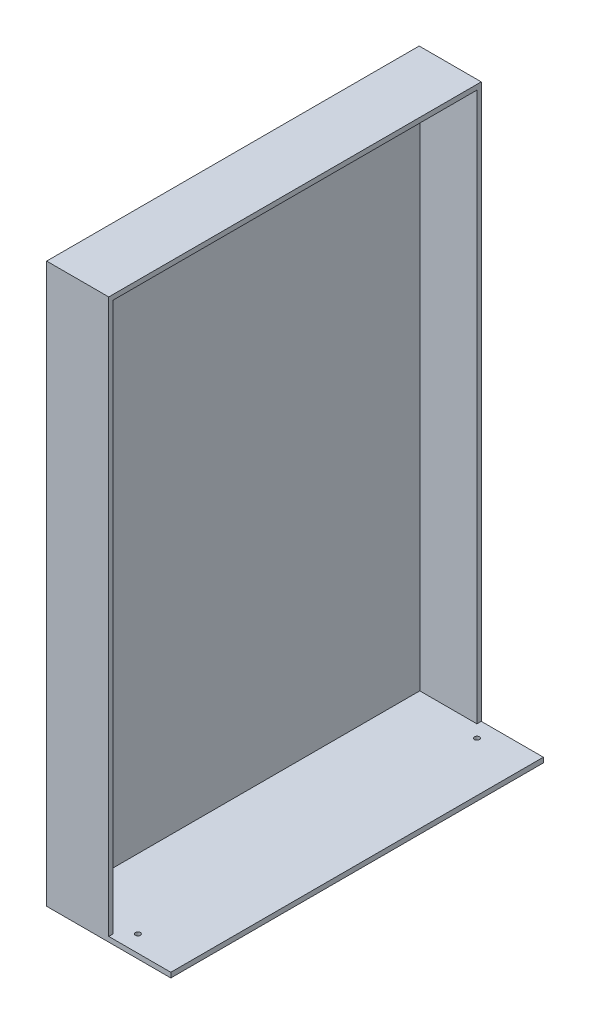
ISO-10303-21;
HEADER;
FILE_DESCRIPTION(('STEP AP214'),'2;1');
FILE_NAME('part.step','',(''),(''),'','','');
FILE_SCHEMA(('AUTOMOTIVE_DESIGN { 1 0 10303 214 1 1 1 1 }'));
ENDSEC;
DATA;
#1=APPLICATION_CONTEXT('core data for automotive mechanical design processes');
#2=APPLICATION_PROTOCOL_DEFINITION('international standard','automotive_design',2000,#1);
#3=PRODUCT_CONTEXT('',#1,'mechanical');
#4=PRODUCT('Part','Part','',(#3));
#5=PRODUCT_RELATED_PRODUCT_CATEGORY('part','',(#4));
#6=PRODUCT_DEFINITION_FORMATION('','',#4);
#7=PRODUCT_DEFINITION_CONTEXT('part definition',#1,'design');
#8=PRODUCT_DEFINITION('design','',#6,#7);
#9=PRODUCT_DEFINITION_SHAPE('','',#8);
#10=(LENGTH_UNIT() NAMED_UNIT(*) SI_UNIT(.MILLI.,.METRE.));
#11=(NAMED_UNIT(*) PLANE_ANGLE_UNIT() SI_UNIT($,.RADIAN.));
#12=(NAMED_UNIT(*) SI_UNIT($,.STERADIAN.) SOLID_ANGLE_UNIT());
#13=UNCERTAINTY_MEASURE_WITH_UNIT(LENGTH_MEASURE(1.E-05),#10,'distance_accuracy_value','');
#14=(GEOMETRIC_REPRESENTATION_CONTEXT(3) GLOBAL_UNCERTAINTY_ASSIGNED_CONTEXT((#13)) GLOBAL_UNIT_ASSIGNED_CONTEXT((#10,
#11,#12)) REPRESENTATION_CONTEXT('',''));
#15=CARTESIAN_POINT('',(0.,0.,0.));
#16=DIRECTION('',(0.,0.,1.));
#17=DIRECTION('',(1.,0.,0.));
#18=AXIS2_PLACEMENT_3D('',#15,#16,#17);
#19=CARTESIAN_POINT('',(0.,4.,0.));
#20=DIRECTION('',(0.,-1.,0.));
#21=DIRECTION('',(0.,0.,-1.));
#22=AXIS2_PLACEMENT_3D('',#19,#20,#21);
#23=PLANE('',#22);
#24=CARTESIAN_POINT('',(60.,4.,-13.5));
#25=DIRECTION('',(0.,-1.,0.));
#26=DIRECTION('',(0.,0.,-1.));
#27=AXIS2_PLACEMENT_3D('',#24,#25,#26);
#28=CIRCLE('',#27,1.99999999999995);
#29=CARTESIAN_POINT('',(60.,4.,-15.4999999999999));
#30=VERTEX_POINT('',#29);
#31=EDGE_CURVE('E356',#30,#30,#28,.T.);
#32=ORIENTED_EDGE('',*,*,#31,.T.);
#33=EDGE_LOOP('',(#32));
#34=FACE_BOUND('',#33,.T.);
#35=CARTESIAN_POINT('',(60.,4.,-286.5));
#36=DIRECTION('',(0.,-1.,0.));
#37=DIRECTION('',(0.,0.,-1.));
#38=AXIS2_PLACEMENT_3D('',#35,#36,#37);
#39=CIRCLE('',#38,1.99999999999995);
#40=CARTESIAN_POINT('',(60.,4.,-288.5));
#41=VERTEX_POINT('',#40);
#42=EDGE_CURVE('E137',#41,#41,#39,.T.);
#43=ORIENTED_EDGE('',*,*,#42,.T.);
#44=EDGE_LOOP('',(#43));
#45=FACE_BOUND('',#44,.T.);
#46=DIRECTION('',(0.,0.,-1.));
#47=VECTOR('',#46,1.);
#48=CARTESIAN_POINT('',(50.,4.,-300.));
#49=LINE('',#48,#47);
#50=CARTESIAN_POINT('',(50.,4.,-296.5));
#51=VERTEX_POINT('',#50);
#52=CARTESIAN_POINT('',(50.,4.,-300.));
#53=VERTEX_POINT('',#52);
#54=EDGE_CURVE('E52',#51,#53,#49,.T.);
#55=ORIENTED_EDGE('',*,*,#54,.F.);
#56=DIRECTION('',(1.,0.,0.));
#57=VECTOR('',#56,1.);
#58=CARTESIAN_POINT('',(4.,4.,-296.5));
#59=LINE('',#58,#57);
#60=CARTESIAN_POINT('',(4.,4.,-296.5));
#61=VERTEX_POINT('',#60);
#62=EDGE_CURVE('E56',#61,#51,#59,.T.);
#63=ORIENTED_EDGE('',*,*,#62,.F.);
#64=DIRECTION('',(0.,0.,-1.));
#65=VECTOR('',#64,1.);
#66=CARTESIAN_POINT('',(4.,4.,-3.5));
#67=LINE('',#66,#65);
#68=CARTESIAN_POINT('',(4.,4.,-3.5));
#69=VERTEX_POINT('',#68);
#70=EDGE_CURVE('E176',#69,#61,#67,.T.);
#71=ORIENTED_EDGE('',*,*,#70,.F.);
#72=DIRECTION('',(-1.,0.,0.));
#73=VECTOR('',#72,1.);
#74=CARTESIAN_POINT('',(4.,4.,-3.5));
#75=LINE('',#74,#73);
#76=CARTESIAN_POINT('',(50.,4.,-3.5));
#77=VERTEX_POINT('',#76);
#78=EDGE_CURVE('E154',#77,#69,#75,.T.);
#79=ORIENTED_EDGE('',*,*,#78,.F.);
#80=DIRECTION('',(0.,0.,-1.));
#81=VECTOR('',#80,1.);
#82=CARTESIAN_POINT('',(50.,4.,0.));
#83=LINE('',#82,#81);
#84=CARTESIAN_POINT('',(50.,4.,0.));
#85=VERTEX_POINT('',#84);
#86=EDGE_CURVE('E144',#85,#77,#83,.T.);
#87=ORIENTED_EDGE('',*,*,#86,.F.);
#88=DIRECTION('',(1.,0.,0.));
#89=VECTOR('',#88,1.);
#90=CARTESIAN_POINT('',(0.,4.,0.));
#91=LINE('',#90,#89);
#92=CARTESIAN_POINT('',(100.,4.,0.));
#93=VERTEX_POINT('',#92);
#94=EDGE_CURVE('E197',#85,#93,#91,.T.);
#95=ORIENTED_EDGE('',*,*,#94,.T.);
#96=DIRECTION('',(0.,0.,-1.));
#97=VECTOR('',#96,1.);
#98=CARTESIAN_POINT('',(100.,4.,0.));
#99=LINE('',#98,#97);
#100=CARTESIAN_POINT('',(100.,4.,-300.));
#101=VERTEX_POINT('',#100);
#102=EDGE_CURVE('E194',#93,#101,#99,.T.);
#103=ORIENTED_EDGE('',*,*,#102,.T.);
#104=DIRECTION('',(-1.,0.,0.));
#105=VECTOR('',#104,1.);
#106=CARTESIAN_POINT('',(0.,4.,-300.));
#107=LINE('',#106,#105);
#108=EDGE_CURVE('E201',#101,#53,#107,.T.);
#109=ORIENTED_EDGE('',*,*,#108,.T.);
#110=EDGE_LOOP('',(#55,#63,#71,#79,#87,#95,#103,#109));
#111=FACE_BOUND('',#110,.T.);
#112=ADVANCED_FACE('F35',(#34,#45,#111),#23,.F.);
#113=CARTESIAN_POINT('',(0.,4.,0.));
#114=DIRECTION('',(1.,0.,0.));
#115=DIRECTION('',(0.,0.,-1.));
#116=AXIS2_PLACEMENT_3D('',#113,#114,#115);
#117=PLANE('',#116);
#118=DIRECTION('',(0.,0.,1.));
#119=VECTOR('',#118,1.);
#120=CARTESIAN_POINT('',(0.,0.,0.));
#121=LINE('',#120,#119);
#122=CARTESIAN_POINT('',(0.,0.,-300.));
#123=VERTEX_POINT('',#122);
#124=CARTESIAN_POINT('',(0.,0.,0.));
#125=VERTEX_POINT('',#124);
#126=EDGE_CURVE('E117',#123,#125,#121,.T.);
#127=ORIENTED_EDGE('',*,*,#126,.T.);
#128=DIRECTION('',(0.,-1.,0.));
#129=VECTOR('',#128,1.);
#130=CARTESIAN_POINT('',(0.,4.,0.));
#131=LINE('',#130,#129);
#132=CARTESIAN_POINT('',(0.,450.,0.));
#133=VERTEX_POINT('',#132);
#134=EDGE_CURVE('E11',#133,#125,#131,.T.);
#135=ORIENTED_EDGE('',*,*,#134,.F.);
#136=DIRECTION('',(0.,0.,1.));
#137=VECTOR('',#136,1.);
#138=CARTESIAN_POINT('',(0.,450.,0.));
#139=LINE('',#138,#137);
#140=CARTESIAN_POINT('',(0.,450.,-300.));
#141=VERTEX_POINT('',#140);
#142=EDGE_CURVE('E115',#141,#133,#139,.T.);
#143=ORIENTED_EDGE('',*,*,#142,.F.);
#144=DIRECTION('',(0.,-1.,0.));
#145=VECTOR('',#144,1.);
#146=CARTESIAN_POINT('',(0.,4.,-300.));
#147=LINE('',#146,#145);
#148=EDGE_CURVE('E203',#141,#123,#147,.T.);
#149=ORIENTED_EDGE('',*,*,#148,.T.);
#150=EDGE_LOOP('',(#127,#135,#143,#149));
#151=FACE_BOUND('',#150,.T.);
#152=ADVANCED_FACE('F37',(#151),#117,.F.);
#153=CARTESIAN_POINT('',(0.,4.,0.));
#154=DIRECTION('',(0.,0.,-1.));
#155=DIRECTION('',(-1.,0.,0.));
#156=AXIS2_PLACEMENT_3D('',#153,#154,#155);
#157=PLANE('',#156);
#158=DIRECTION('',(1.,0.,0.));
#159=VECTOR('',#158,1.);
#160=CARTESIAN_POINT('',(0.,0.,0.));
#161=LINE('',#160,#159);
#162=CARTESIAN_POINT('',(100.,0.,0.));
#163=VERTEX_POINT('',#162);
#164=EDGE_CURVE('E208',#125,#163,#161,.T.);
#165=ORIENTED_EDGE('',*,*,#164,.T.);
#166=DIRECTION('',(0.,-1.,0.));
#167=VECTOR('',#166,1.);
#168=CARTESIAN_POINT('',(100.,4.,0.));
#169=LINE('',#168,#167);
#170=EDGE_CURVE('E44',#93,#163,#169,.T.);
#171=ORIENTED_EDGE('',*,*,#170,.F.);
#172=ORIENTED_EDGE('',*,*,#94,.F.);
#173=DIRECTION('',(0.,-1.,0.));
#174=VECTOR('',#173,1.);
#175=CARTESIAN_POINT('',(50.,446.,0.));
#176=LINE('',#175,#174);
#177=CARTESIAN_POINT('',(50.,450.,0.));
#178=VERTEX_POINT('',#177);
#179=EDGE_CURVE('E124',#178,#85,#176,.T.);
#180=ORIENTED_EDGE('',*,*,#179,.F.);
#181=DIRECTION('',(1.,0.,0.));
#182=VECTOR('',#181,1.);
#183=CARTESIAN_POINT('',(0.,450.,0.));
#184=LINE('',#183,#182);
#185=EDGE_CURVE('E120',#133,#178,#184,.T.);
#186=ORIENTED_EDGE('',*,*,#185,.F.);
#187=ORIENTED_EDGE('',*,*,#134,.T.);
#188=EDGE_LOOP('',(#165,#171,#172,#180,#186,#187));
#189=FACE_BOUND('',#188,.T.);
#190=ADVANCED_FACE('F121',(#189),#157,.F.);
#191=CARTESIAN_POINT('',(100.,4.,0.));
#192=DIRECTION('',(-1.,0.,0.));
#193=DIRECTION('',(0.,0.,1.));
#194=AXIS2_PLACEMENT_3D('',#191,#192,#193);
#195=PLANE('',#194);
#196=DIRECTION('',(0.,0.,-1.));
#197=VECTOR('',#196,1.);
#198=CARTESIAN_POINT('',(100.,0.,0.));
#199=LINE('',#198,#197);
#200=CARTESIAN_POINT('',(100.,0.,-300.));
#201=VERTEX_POINT('',#200);
#202=EDGE_CURVE('E210',#163,#201,#199,.T.);
#203=ORIENTED_EDGE('',*,*,#202,.T.);
#204=DIRECTION('',(0.,-1.,0.));
#205=VECTOR('',#204,1.);
#206=CARTESIAN_POINT('',(100.,4.,-300.));
#207=LINE('',#206,#205);
#208=EDGE_CURVE('E214',#101,#201,#207,.T.);
#209=ORIENTED_EDGE('',*,*,#208,.F.);
#210=ORIENTED_EDGE('',*,*,#102,.F.);
#211=ORIENTED_EDGE('',*,*,#170,.T.);
#212=EDGE_LOOP('',(#203,#209,#210,#211));
#213=FACE_BOUND('',#212,.T.);
#214=ADVANCED_FACE('F221',(#213),#195,.F.);
#215=CARTESIAN_POINT('',(0.,4.,-300.));
#216=DIRECTION('',(0.,0.,1.));
#217=DIRECTION('',(1.,0.,0.));
#218=AXIS2_PLACEMENT_3D('',#215,#216,#217);
#219=PLANE('',#218);
#220=DIRECTION('',(-1.,0.,0.));
#221=VECTOR('',#220,1.);
#222=CARTESIAN_POINT('',(0.,0.,-300.));
#223=LINE('',#222,#221);
#224=EDGE_CURVE('E199',#201,#123,#223,.T.);
#225=ORIENTED_EDGE('',*,*,#224,.T.);
#226=ORIENTED_EDGE('',*,*,#148,.F.);
#227=DIRECTION('',(-1.,0.,0.));
#228=VECTOR('',#227,1.);
#229=CARTESIAN_POINT('',(0.,450.,-300.));
#230=LINE('',#229,#228);
#231=CARTESIAN_POINT('',(50.,450.,-300.));
#232=VERTEX_POINT('',#231);
#233=EDGE_CURVE('E133',#232,#141,#230,.T.);
#234=ORIENTED_EDGE('',*,*,#233,.F.);
#235=DIRECTION('',(0.,-1.,0.));
#236=VECTOR('',#235,1.);
#237=CARTESIAN_POINT('',(50.,446.,-300.));
#238=LINE('',#237,#236);
#239=EDGE_CURVE('E160',#232,#53,#238,.T.);
#240=ORIENTED_EDGE('',*,*,#239,.T.);
#241=ORIENTED_EDGE('',*,*,#108,.F.);
#242=ORIENTED_EDGE('',*,*,#208,.T.);
#243=EDGE_LOOP('',(#225,#226,#234,#240,#241,#242));
#244=FACE_BOUND('',#243,.T.);
#245=ADVANCED_FACE('F227',(#244),#219,.F.);
#246=CARTESIAN_POINT('',(0.,0.,0.));
#247=DIRECTION('',(0.,-1.,0.));
#248=DIRECTION('',(0.,0.,-1.));
#249=AXIS2_PLACEMENT_3D('',#246,#247,#248);
#250=PLANE('',#249);
#251=CARTESIAN_POINT('',(60.,0.,-13.5));
#252=DIRECTION('',(0.,-1.,0.));
#253=DIRECTION('',(0.,0.,-1.));
#254=AXIS2_PLACEMENT_3D('',#251,#252,#253);
#255=CIRCLE('',#254,2.);
#256=CARTESIAN_POINT('',(60.,0.,-15.5));
#257=VERTEX_POINT('',#256);
#258=EDGE_CURVE('E354',#257,#257,#255,.T.);
#259=ORIENTED_EDGE('',*,*,#258,.F.);
#260=EDGE_LOOP('',(#259));
#261=FACE_BOUND('',#260,.T.);
#262=CARTESIAN_POINT('',(60.,0.,-286.5));
#263=DIRECTION('',(0.,-1.,0.));
#264=DIRECTION('',(0.,0.,-1.));
#265=AXIS2_PLACEMENT_3D('',#262,#263,#264);
#266=CIRCLE('',#265,2.);
#267=CARTESIAN_POINT('',(60.,0.,-288.5));
#268=VERTEX_POINT('',#267);
#269=EDGE_CURVE('E357',#268,#268,#266,.T.);
#270=ORIENTED_EDGE('',*,*,#269,.F.);
#271=EDGE_LOOP('',(#270));
#272=FACE_BOUND('',#271,.T.);
#273=ORIENTED_EDGE('',*,*,#126,.F.);
#274=ORIENTED_EDGE('',*,*,#224,.F.);
#275=ORIENTED_EDGE('',*,*,#202,.F.);
#276=ORIENTED_EDGE('',*,*,#164,.F.);
#277=EDGE_LOOP('',(#273,#274,#275,#276));
#278=FACE_BOUND('',#277,.T.);
#279=ADVANCED_FACE('F225',(#261,#272,#278),#250,.T.);
#280=CARTESIAN_POINT('',(50.,446.,0.));
#281=DIRECTION('',(-1.,0.,0.));
#282=DIRECTION('',(0.,0.,1.));
#283=AXIS2_PLACEMENT_3D('',#280,#281,#282);
#284=PLANE('',#283);
#285=ORIENTED_EDGE('',*,*,#86,.T.);
#286=DIRECTION('',(0.,-1.,0.));
#287=VECTOR('',#286,1.);
#288=CARTESIAN_POINT('',(50.,446.,-3.5));
#289=LINE('',#288,#287);
#290=CARTESIAN_POINT('',(50.,446.,-3.5));
#291=VERTEX_POINT('',#290);
#292=EDGE_CURVE('E163',#291,#77,#289,.T.);
#293=ORIENTED_EDGE('',*,*,#292,.F.);
#294=DIRECTION('',(0.,0.,-1.));
#295=VECTOR('',#294,1.);
#296=CARTESIAN_POINT('',(50.,446.,0.));
#297=LINE('',#296,#295);
#298=CARTESIAN_POINT('',(50.,446.,-296.5));
#299=VERTEX_POINT('',#298);
#300=EDGE_CURVE('E134',#291,#299,#297,.T.);
#301=ORIENTED_EDGE('',*,*,#300,.T.);
#302=DIRECTION('',(0.,-1.,0.));
#303=VECTOR('',#302,1.);
#304=CARTESIAN_POINT('',(50.,446.,-296.5));
#305=LINE('',#304,#303);
#306=EDGE_CURVE('E189',#299,#51,#305,.T.);
#307=ORIENTED_EDGE('',*,*,#306,.T.);
#308=ORIENTED_EDGE('',*,*,#54,.T.);
#309=ORIENTED_EDGE('',*,*,#239,.F.);
#310=DIRECTION('',(0.,0.,-1.));
#311=VECTOR('',#310,1.);
#312=CARTESIAN_POINT('',(50.,450.,0.));
#313=LINE('',#312,#311);
#314=EDGE_CURVE('E128',#178,#232,#313,.T.);
#315=ORIENTED_EDGE('',*,*,#314,.F.);
#316=ORIENTED_EDGE('',*,*,#179,.T.);
#317=EDGE_LOOP('',(#285,#293,#301,#307,#308,#309,#315,#316));
#318=FACE_BOUND('',#317,.T.);
#319=ADVANCED_FACE('F230',(#318),#284,.F.);
#320=CARTESIAN_POINT('',(4.,446.,-3.5));
#321=DIRECTION('',(0.,0.,1.));
#322=DIRECTION('',(1.,0.,0.));
#323=AXIS2_PLACEMENT_3D('',#320,#321,#322);
#324=PLANE('',#323);
#325=ORIENTED_EDGE('',*,*,#78,.T.);
#326=DIRECTION('',(0.,-1.,0.));
#327=VECTOR('',#326,1.);
#328=CARTESIAN_POINT('',(4.,446.,-3.5));
#329=LINE('',#328,#327);
#330=CARTESIAN_POINT('',(4.,446.,-3.5));
#331=VERTEX_POINT('',#330);
#332=EDGE_CURVE('E166',#331,#69,#329,.T.);
#333=ORIENTED_EDGE('',*,*,#332,.F.);
#334=DIRECTION('',(-1.,0.,0.));
#335=VECTOR('',#334,1.);
#336=CARTESIAN_POINT('',(4.,446.,-3.5));
#337=LINE('',#336,#335);
#338=EDGE_CURVE('E151',#291,#331,#337,.T.);
#339=ORIENTED_EDGE('',*,*,#338,.F.);
#340=ORIENTED_EDGE('',*,*,#292,.T.);
#341=EDGE_LOOP('',(#325,#333,#339,#340));
#342=FACE_BOUND('',#341,.T.);
#343=ADVANCED_FACE('F242',(#342),#324,.F.);
#344=CARTESIAN_POINT('',(4.,446.,-3.5));
#345=DIRECTION('',(-1.,0.,0.));
#346=DIRECTION('',(0.,0.,1.));
#347=AXIS2_PLACEMENT_3D('',#344,#345,#346);
#348=PLANE('',#347);
#349=ORIENTED_EDGE('',*,*,#70,.T.);
#350=DIRECTION('',(0.,-1.,0.));
#351=VECTOR('',#350,1.);
#352=CARTESIAN_POINT('',(4.,446.,-296.5));
#353=LINE('',#352,#351);
#354=CARTESIAN_POINT('',(4.,446.,-296.5));
#355=VERTEX_POINT('',#354);
#356=EDGE_CURVE('E186',#355,#61,#353,.T.);
#357=ORIENTED_EDGE('',*,*,#356,.F.);
#358=DIRECTION('',(0.,0.,-1.));
#359=VECTOR('',#358,1.);
#360=CARTESIAN_POINT('',(4.,446.,-3.5));
#361=LINE('',#360,#359);
#362=EDGE_CURVE('E147',#331,#355,#361,.T.);
#363=ORIENTED_EDGE('',*,*,#362,.F.);
#364=ORIENTED_EDGE('',*,*,#332,.T.);
#365=EDGE_LOOP('',(#349,#357,#363,#364));
#366=FACE_BOUND('',#365,.T.);
#367=ADVANCED_FACE('F239',(#366),#348,.F.);
#368=CARTESIAN_POINT('',(4.,446.,-296.5));
#369=DIRECTION('',(0.,0.,-1.));
#370=DIRECTION('',(-1.,0.,0.));
#371=AXIS2_PLACEMENT_3D('',#368,#369,#370);
#372=PLANE('',#371);
#373=ORIENTED_EDGE('',*,*,#62,.T.);
#374=ORIENTED_EDGE('',*,*,#306,.F.);
#375=DIRECTION('',(1.,0.,0.));
#376=VECTOR('',#375,1.);
#377=CARTESIAN_POINT('',(4.,446.,-296.5));
#378=LINE('',#377,#376);
#379=EDGE_CURVE('E150',#355,#299,#378,.T.);
#380=ORIENTED_EDGE('',*,*,#379,.F.);
#381=ORIENTED_EDGE('',*,*,#356,.T.);
#382=EDGE_LOOP('',(#373,#374,#380,#381));
#383=FACE_BOUND('',#382,.T.);
#384=ADVANCED_FACE('F235',(#383),#372,.F.);
#385=CARTESIAN_POINT('',(0.,450.,0.));
#386=DIRECTION('',(0.,-1.,0.));
#387=DIRECTION('',(0.,0.,-1.));
#388=AXIS2_PLACEMENT_3D('',#385,#386,#387);
#389=PLANE('',#388);
#390=ORIENTED_EDGE('',*,*,#142,.T.);
#391=ORIENTED_EDGE('',*,*,#185,.T.);
#392=ORIENTED_EDGE('',*,*,#314,.T.);
#393=ORIENTED_EDGE('',*,*,#233,.T.);
#394=EDGE_LOOP('',(#390,#391,#392,#393));
#395=FACE_BOUND('',#394,.T.);
#396=ADVANCED_FACE('F131',(#395),#389,.F.);
#397=CARTESIAN_POINT('',(0.,446.,0.));
#398=DIRECTION('',(0.,-1.,0.));
#399=DIRECTION('',(0.,0.,-1.));
#400=AXIS2_PLACEMENT_3D('',#397,#398,#399);
#401=PLANE('',#400);
#402=ORIENTED_EDGE('',*,*,#300,.F.);
#403=ORIENTED_EDGE('',*,*,#338,.T.);
#404=ORIENTED_EDGE('',*,*,#362,.T.);
#405=ORIENTED_EDGE('',*,*,#379,.T.);
#406=EDGE_LOOP('',(#402,#403,#404,#405));
#407=FACE_BOUND('',#406,.T.);
#408=ADVANCED_FACE('F236',(#407),#401,.T.);
#409=CARTESIAN_POINT('',(60.,0.,-286.5));
#410=DIRECTION('',(0.,-1.,0.));
#411=DIRECTION('',(0.,0.,-1.));
#412=AXIS2_PLACEMENT_3D('',#409,#410,#411);
#413=CYLINDRICAL_SURFACE('',#412,1.99999999999995);
#414=ORIENTED_EDGE('',*,*,#269,.T.);
#415=EDGE_LOOP('',(#414));
#416=FACE_BOUND('',#415,.T.);
#417=ORIENTED_EDGE('',*,*,#42,.F.);
#418=EDGE_LOOP('',(#417));
#419=FACE_BOUND('',#418,.T.);
#420=ADVANCED_FACE('F328',(#416,#419),#413,.F.);
#421=CARTESIAN_POINT('',(60.,0.,-13.5));
#422=DIRECTION('',(0.,-1.,0.));
#423=DIRECTION('',(0.,0.,-1.));
#424=AXIS2_PLACEMENT_3D('',#421,#422,#423);
#425=CYLINDRICAL_SURFACE('',#424,1.99999999999995);
#426=ORIENTED_EDGE('',*,*,#258,.T.);
#427=EDGE_LOOP('',(#426));
#428=FACE_BOUND('',#427,.T.);
#429=ORIENTED_EDGE('',*,*,#31,.F.);
#430=EDGE_LOOP('',(#429));
#431=FACE_BOUND('',#430,.T.);
#432=ADVANCED_FACE('F337',(#428,#431),#425,.F.);
#433=CLOSED_SHELL('',(#112,#152,#190,#214,#245,#279,#319,#343,#367,#384,#396,#408,#420,#432));
#434=MANIFOLD_SOLID_BREP('B2',#433);
#435=ADVANCED_BREP_SHAPE_REPRESENTATION('',(#18,#434),#14);
#436=SHAPE_DEFINITION_REPRESENTATION(#9,#435);
ENDSEC;
END-ISO-10303-21;
